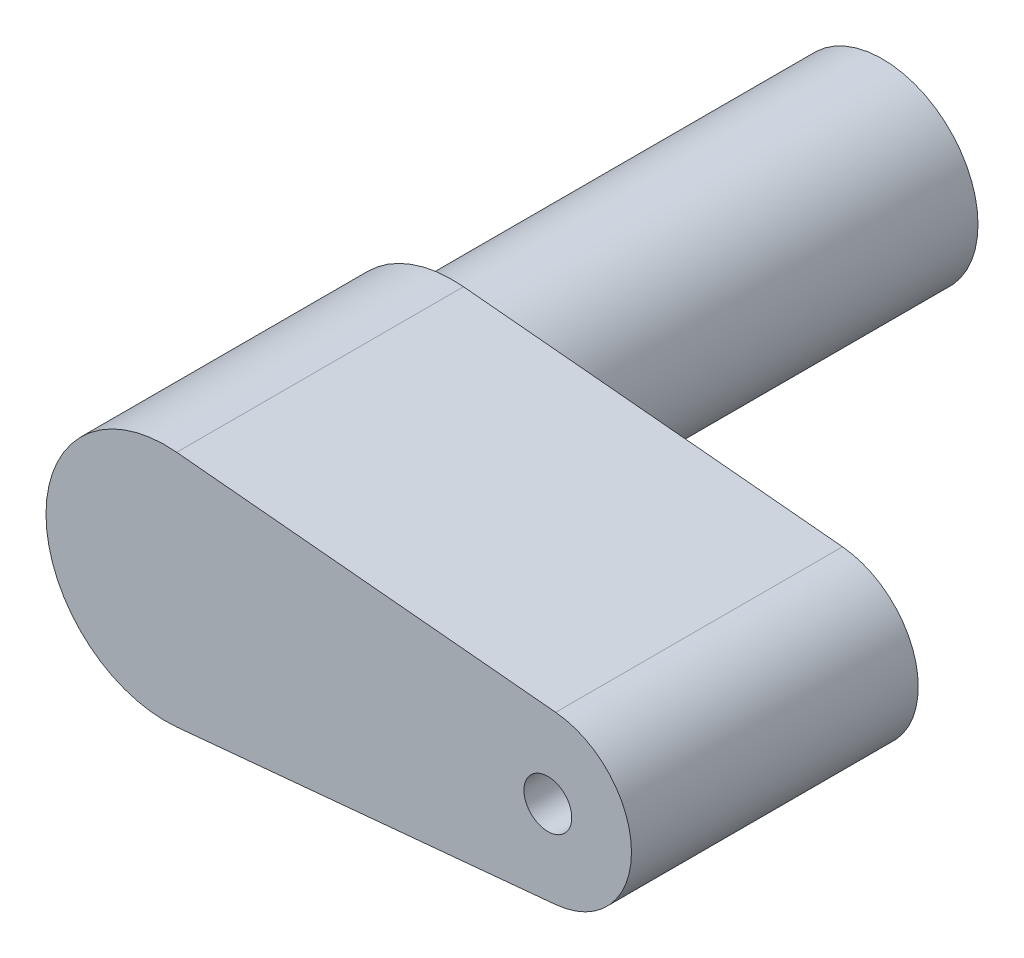
ISO-10303-21;
HEADER;
FILE_DESCRIPTION(('STEP AP214'),'2;1');
FILE_NAME('part.step','',(''),(''),'','','');
FILE_SCHEMA(('AUTOMOTIVE_DESIGN { 1 0 10303 214 1 1 1 1 }'));
ENDSEC;
DATA;
#1=APPLICATION_CONTEXT('core data for automotive mechanical design processes');
#2=APPLICATION_PROTOCOL_DEFINITION('international standard','automotive_design',2000,#1);
#3=PRODUCT_CONTEXT('',#1,'mechanical');
#4=PRODUCT('Part','Part','',(#3));
#5=PRODUCT_RELATED_PRODUCT_CATEGORY('part','',(#4));
#6=PRODUCT_DEFINITION_FORMATION('','',#4);
#7=PRODUCT_DEFINITION_CONTEXT('part definition',#1,'design');
#8=PRODUCT_DEFINITION('design','',#6,#7);
#9=PRODUCT_DEFINITION_SHAPE('','',#8);
#10=(LENGTH_UNIT() NAMED_UNIT(*) SI_UNIT(.MILLI.,.METRE.));
#11=(NAMED_UNIT(*) PLANE_ANGLE_UNIT() SI_UNIT($,.RADIAN.));
#12=(NAMED_UNIT(*) SI_UNIT($,.STERADIAN.) SOLID_ANGLE_UNIT());
#13=UNCERTAINTY_MEASURE_WITH_UNIT(LENGTH_MEASURE(1.E-05),#10,'distance_accuracy_value','');
#14=(GEOMETRIC_REPRESENTATION_CONTEXT(3) GLOBAL_UNCERTAINTY_ASSIGNED_CONTEXT((#13)) GLOBAL_UNIT_ASSIGNED_CONTEXT((#10,
#11,#12)) REPRESENTATION_CONTEXT('',''));
#15=CARTESIAN_POINT('',(0.,0.,0.));
#16=DIRECTION('',(0.,0.,1.));
#17=DIRECTION('',(1.,0.,0.));
#18=AXIS2_PLACEMENT_3D('',#15,#16,#17);
#19=CARTESIAN_POINT('',(0.,491.000207075114,30.));
#20=DIRECTION('',(0.,0.,-1.));
#21=DIRECTION('',(-1.,0.,0.));
#22=AXIS2_PLACEMENT_3D('',#19,#20,#21);
#23=CYLINDRICAL_SURFACE('',#22,4.);
#24=CARTESIAN_POINT('',(0.,491.000207075114,0.));
#25=DIRECTION('',(0.,0.,1.));
#26=DIRECTION('',(1.,0.,0.));
#27=AXIS2_PLACEMENT_3D('',#24,#25,#26);
#28=CIRCLE('',#27,4.);
#29=CARTESIAN_POINT('',(3.99999999999999,491.000207075114,0.));
#30=VERTEX_POINT('',#29);
#31=EDGE_CURVE('E48',#30,#30,#28,.T.);
#32=ORIENTED_EDGE('',*,*,#31,.T.);
#33=EDGE_LOOP('',(#32));
#34=FACE_BOUND('',#33,.T.);
#35=CARTESIAN_POINT('',(0.,491.000207075114,18.));
#36=DIRECTION('',(0.,0.,1.));
#37=DIRECTION('',(1.,0.,0.));
#38=AXIS2_PLACEMENT_3D('',#35,#36,#37);
#39=CIRCLE('',#38,4.);
#40=CARTESIAN_POINT('',(3.99999999999999,491.000207075114,18.));
#41=VERTEX_POINT('',#40);
#42=EDGE_CURVE('E11',#41,#41,#39,.T.);
#43=ORIENTED_EDGE('',*,*,#42,.F.);
#44=EDGE_LOOP('',(#43));
#45=FACE_BOUND('',#44,.T.);
#46=ADVANCED_FACE('F39',(#34,#45),#23,.T.);
#47=CARTESIAN_POINT('',(0.,491.000207075114,30.));
#48=DIRECTION('',(0.,0.,-1.));
#49=DIRECTION('',(-1.,0.,0.));
#50=AXIS2_PLACEMENT_3D('',#47,#48,#49);
#51=CYLINDRICAL_SURFACE('',#50,1.25);
#52=CARTESIAN_POINT('',(0.,491.000207075114,0.));
#53=DIRECTION('',(0.,0.,1.));
#54=DIRECTION('',(1.,0.,0.));
#55=AXIS2_PLACEMENT_3D('',#52,#53,#54);
#56=CIRCLE('',#55,1.25);
#57=CARTESIAN_POINT('',(1.24999999999999,491.000207075114,0.));
#58=VERTEX_POINT('',#57);
#59=EDGE_CURVE('E121',#58,#58,#56,.T.);
#60=ORIENTED_EDGE('',*,*,#59,.F.);
#61=EDGE_LOOP('',(#60));
#62=FACE_BOUND('',#61,.T.);
#63=CARTESIAN_POINT('',(0.,491.000207075114,18.));
#64=DIRECTION('',(0.,0.,1.));
#65=DIRECTION('',(1.,0.,0.));
#66=AXIS2_PLACEMENT_3D('',#63,#64,#65);
#67=CIRCLE('',#66,1.25);
#68=CARTESIAN_POINT('',(1.24999999999999,491.000207075114,18.));
#69=VERTEX_POINT('',#68);
#70=EDGE_CURVE('E42',#69,#69,#67,.T.);
#71=ORIENTED_EDGE('',*,*,#70,.T.);
#72=EDGE_LOOP('',(#71));
#73=FACE_BOUND('',#72,.T.);
#74=ADVANCED_FACE('F132',(#62,#73),#51,.F.);
#75=CARTESIAN_POINT('',(0.,491.000207075114,0.));
#76=DIRECTION('',(0.,0.,1.));
#77=DIRECTION('',(1.,0.,0.));
#78=AXIS2_PLACEMENT_3D('',#75,#76,#77);
#79=PLANE('',#78);
#80=ORIENTED_EDGE('',*,*,#31,.F.);
#81=EDGE_LOOP('',(#80));
#82=FACE_BOUND('',#81,.T.);
#83=ORIENTED_EDGE('',*,*,#59,.T.);
#84=EDGE_LOOP('',(#83));
#85=FACE_BOUND('',#84,.T.);
#86=ADVANCED_FACE('F128',(#82,#85),#79,.F.);
#87=CARTESIAN_POINT('',(16.,491.000207075114,18.));
#88=DIRECTION('',(0.,0.,1.));
#89=DIRECTION('',(1.,0.,0.));
#90=AXIS2_PLACEMENT_3D('',#87,#88,#89);
#91=PLANE('',#90);
#92=ORIENTED_EDGE('',*,*,#70,.F.);
#93=EDGE_LOOP('',(#92));
#94=FACE_BOUND('',#93,.T.);
#95=ADVANCED_FACE('F131',(#94),#91,.F.);
#96=CARTESIAN_POINT('',(16.,491.000207075114,18.));
#97=DIRECTION('',(0.,0.,1.));
#98=DIRECTION('',(1.,0.,0.));
#99=AXIS2_PLACEMENT_3D('',#96,#97,#98);
#100=CYLINDRICAL_SURFACE('',#99,3.50000000000001);
#101=CARTESIAN_POINT('',(16.,491.000207075114,30.));
#102=DIRECTION('',(0.,0.,1.));
#103=DIRECTION('',(1.,0.,0.));
#104=AXIS2_PLACEMENT_3D('',#101,#102,#103);
#105=CIRCLE('',#104,3.50000000000001);
#106=CARTESIAN_POINT('',(16.328125,487.51562187966,30.));
#107=VERTEX_POINT('',#106);
#108=CARTESIAN_POINT('',(16.328125,494.484792270567,30.));
#109=VERTEX_POINT('',#108);
#110=EDGE_CURVE('E109',#107,#109,#105,.T.);
#111=ORIENTED_EDGE('',*,*,#110,.F.);
#112=DIRECTION('',(0.,0.,1.));
#113=VECTOR('',#112,1.);
#114=CARTESIAN_POINT('',(16.328125,487.51562187966,18.));
#115=LINE('',#114,#113);
#116=CARTESIAN_POINT('',(16.328125,487.51562187966,18.));
#117=VERTEX_POINT('',#116);
#118=EDGE_CURVE('E57',#117,#107,#115,.T.);
#119=ORIENTED_EDGE('',*,*,#118,.F.);
#120=CARTESIAN_POINT('',(16.,491.000207075114,18.));
#121=DIRECTION('',(0.,0.,1.));
#122=DIRECTION('',(1.,0.,0.));
#123=AXIS2_PLACEMENT_3D('',#120,#121,#122);
#124=CIRCLE('',#123,3.50000000000001);
#125=CARTESIAN_POINT('',(16.328125,494.484792270567,18.));
#126=VERTEX_POINT('',#125);
#127=EDGE_CURVE('E102',#117,#126,#124,.T.);
#128=ORIENTED_EDGE('',*,*,#127,.T.);
#129=DIRECTION('',(0.,0.,1.));
#130=VECTOR('',#129,1.);
#131=CARTESIAN_POINT('',(16.328125,494.484792270567,18.));
#132=LINE('',#131,#130);
#133=EDGE_CURVE('E85',#126,#109,#132,.T.);
#134=ORIENTED_EDGE('',*,*,#133,.T.);
#135=EDGE_LOOP('',(#111,#119,#128,#134));
#136=FACE_BOUND('',#135,.T.);
#137=ADVANCED_FACE('F142',(#136),#100,.T.);
#138=CARTESIAN_POINT('',(0.468749999999982,486.022228224466,18.));
#139=DIRECTION('',(0.0937499999999982,-0.995595770129625,0.));
#140=DIRECTION('',(0.995595770129625,0.0937499999999983,0.));
#141=AXIS2_PLACEMENT_3D('',#138,#139,#140);
#142=PLANE('',#141);
#143=DIRECTION('',(0.995595770129625,0.0937499999999983,0.));
#144=VECTOR('',#143,1.);
#145=CARTESIAN_POINT('',(0.468749999999982,486.022228224466,30.));
#146=LINE('',#145,#144);
#147=CARTESIAN_POINT('',(0.46874999999998,486.022228224466,30.));
#148=VERTEX_POINT('',#147);
#149=EDGE_CURVE('E104',#148,#107,#146,.T.);
#150=ORIENTED_EDGE('',*,*,#149,.F.);
#151=DIRECTION('',(0.,0.,1.));
#152=VECTOR('',#151,1.);
#153=CARTESIAN_POINT('',(0.46874999999998,486.022228224466,18.));
#154=LINE('',#153,#152);
#155=CARTESIAN_POINT('',(0.46874999999998,486.022228224466,18.));
#156=VERTEX_POINT('',#155);
#157=EDGE_CURVE('E74',#156,#148,#154,.T.);
#158=ORIENTED_EDGE('',*,*,#157,.F.);
#159=DIRECTION('',(0.995595770129625,0.0937499999999983,0.));
#160=VECTOR('',#159,1.);
#161=CARTESIAN_POINT('',(0.468749999999982,486.022228224466,18.));
#162=LINE('',#161,#160);
#163=EDGE_CURVE('E99',#156,#117,#162,.T.);
#164=ORIENTED_EDGE('',*,*,#163,.T.);
#165=ORIENTED_EDGE('',*,*,#118,.T.);
#166=EDGE_LOOP('',(#150,#158,#164,#165));
#167=FACE_BOUND('',#166,.T.);
#168=ADVANCED_FACE('F147',(#167),#142,.T.);
#169=CARTESIAN_POINT('',(0.,491.000207075114,18.));
#170=DIRECTION('',(0.,0.,1.));
#171=DIRECTION('',(1.,0.,0.));
#172=AXIS2_PLACEMENT_3D('',#169,#170,#171);
#173=CYLINDRICAL_SURFACE('',#172,4.99999999999998);
#174=CARTESIAN_POINT('',(0.,491.000207075114,30.));
#175=DIRECTION('',(0.,0.,1.));
#176=DIRECTION('',(1.,0.,0.));
#177=AXIS2_PLACEMENT_3D('',#174,#175,#176);
#178=CIRCLE('',#177,4.99999999999998);
#179=CARTESIAN_POINT('',(0.468749999999981,495.978185925762,30.));
#180=VERTEX_POINT('',#179);
#181=EDGE_CURVE('E93',#180,#148,#178,.T.);
#182=ORIENTED_EDGE('',*,*,#181,.F.);
#183=DIRECTION('',(0.,0.,1.));
#184=VECTOR('',#183,1.);
#185=CARTESIAN_POINT('',(0.468749999999981,495.978185925762,18.));
#186=LINE('',#185,#184);
#187=CARTESIAN_POINT('',(0.468749999999981,495.978185925762,18.));
#188=VERTEX_POINT('',#187);
#189=EDGE_CURVE('E88',#188,#180,#186,.T.);
#190=ORIENTED_EDGE('',*,*,#189,.F.);
#191=CARTESIAN_POINT('',(0.,491.000207075114,18.));
#192=DIRECTION('',(0.,0.,1.));
#193=DIRECTION('',(1.,0.,0.));
#194=AXIS2_PLACEMENT_3D('',#191,#192,#193);
#195=CIRCLE('',#194,4.99999999999998);
#196=EDGE_CURVE('E91',#188,#156,#195,.T.);
#197=ORIENTED_EDGE('',*,*,#196,.T.);
#198=ORIENTED_EDGE('',*,*,#157,.T.);
#199=EDGE_LOOP('',(#182,#190,#197,#198));
#200=FACE_BOUND('',#199,.T.);
#201=ADVANCED_FACE('F90',(#200),#173,.T.);
#202=CARTESIAN_POINT('',(0.468749999999981,495.978185925762,18.));
#203=DIRECTION('',(0.0937499999999982,0.995595770129625,0.));
#204=DIRECTION('',(-0.995595770129625,0.0937499999999982,0.));
#205=AXIS2_PLACEMENT_3D('',#202,#203,#204);
#206=PLANE('',#205);
#207=DIRECTION('',(-0.995595770129625,0.0937499999999982,0.));
#208=VECTOR('',#207,1.);
#209=CARTESIAN_POINT('',(0.468749999999981,495.978185925762,30.));
#210=LINE('',#209,#208);
#211=EDGE_CURVE('E112',#109,#180,#210,.T.);
#212=ORIENTED_EDGE('',*,*,#211,.F.);
#213=ORIENTED_EDGE('',*,*,#133,.F.);
#214=DIRECTION('',(-0.995595770129625,0.0937499999999982,0.));
#215=VECTOR('',#214,1.);
#216=CARTESIAN_POINT('',(0.468749999999981,495.978185925762,18.));
#217=LINE('',#216,#215);
#218=EDGE_CURVE('E98',#126,#188,#217,.T.);
#219=ORIENTED_EDGE('',*,*,#218,.T.);
#220=ORIENTED_EDGE('',*,*,#189,.T.);
#221=EDGE_LOOP('',(#212,#213,#219,#220));
#222=FACE_BOUND('',#221,.T.);
#223=ADVANCED_FACE('F101',(#222),#206,.T.);
#224=CARTESIAN_POINT('',(16.,491.000207075114,18.));
#225=DIRECTION('',(0.,0.,1.));
#226=DIRECTION('',(1.,0.,0.));
#227=AXIS2_PLACEMENT_3D('',#224,#225,#226);
#228=CIRCLE('',#227,1.);
#229=CARTESIAN_POINT('',(17.,491.000207075114,18.));
#230=VERTEX_POINT('',#229);
#231=EDGE_CURVE('E113',#230,#230,#228,.F.);
#232=ORIENTED_EDGE('',*,*,#231,.F.);
#233=EDGE_LOOP('',(#232));
#234=FACE_BOUND('',#233,.T.);
#235=ORIENTED_EDGE('',*,*,#42,.T.);
#236=EDGE_LOOP('',(#235));
#237=FACE_BOUND('',#236,.T.);
#238=ORIENTED_EDGE('',*,*,#127,.F.);
#239=ORIENTED_EDGE('',*,*,#163,.F.);
#240=ORIENTED_EDGE('',*,*,#196,.F.);
#241=ORIENTED_EDGE('',*,*,#218,.F.);
#242=EDGE_LOOP('',(#238,#239,#240,#241));
#243=FACE_BOUND('',#242,.T.);
#244=ADVANCED_FACE('F97',(#234,#237,#243),#91,.F.);
#245=CARTESIAN_POINT('',(0.,491.000207075114,30.));
#246=DIRECTION('',(0.,0.,1.));
#247=DIRECTION('',(1.,0.,0.));
#248=AXIS2_PLACEMENT_3D('',#245,#246,#247);
#249=PLANE('',#248);
#250=CARTESIAN_POINT('',(16.,491.000207075114,30.));
#251=DIRECTION('',(0.,0.,1.));
#252=DIRECTION('',(1.,0.,0.));
#253=AXIS2_PLACEMENT_3D('',#250,#251,#252);
#254=CIRCLE('',#253,1.);
#255=CARTESIAN_POINT('',(17.,491.000207075114,30.));
#256=VERTEX_POINT('',#255);
#257=EDGE_CURVE('E238',#256,#256,#254,.T.);
#258=ORIENTED_EDGE('',*,*,#257,.F.);
#259=EDGE_LOOP('',(#258));
#260=FACE_BOUND('',#259,.T.);
#261=ORIENTED_EDGE('',*,*,#110,.T.);
#262=ORIENTED_EDGE('',*,*,#211,.T.);
#263=ORIENTED_EDGE('',*,*,#181,.T.);
#264=ORIENTED_EDGE('',*,*,#149,.T.);
#265=EDGE_LOOP('',(#261,#262,#263,#264));
#266=FACE_BOUND('',#265,.T.);
#267=ADVANCED_FACE('F152',(#260,#266),#249,.T.);
#268=CARTESIAN_POINT('',(16.,491.000207075114,15.1715728752538));
#269=DIRECTION('',(0.,0.,1.));
#270=DIRECTION('',(1.,0.,0.));
#271=AXIS2_PLACEMENT_3D('',#268,#269,#270);
#272=CYLINDRICAL_SURFACE('',#271,1.);
#273=ORIENTED_EDGE('',*,*,#231,.T.);
#274=EDGE_LOOP('',(#273));
#275=FACE_BOUND('',#274,.T.);
#276=ORIENTED_EDGE('',*,*,#257,.T.);
#277=EDGE_LOOP('',(#276));
#278=FACE_BOUND('',#277,.T.);
#279=ADVANCED_FACE('F216',(#275,#278),#272,.F.);
#280=CLOSED_SHELL('',(#46,#74,#86,#95,#137,#168,#201,#223,#244,#267,#279));
#281=MANIFOLD_SOLID_BREP('B2',#280);
#282=ADVANCED_BREP_SHAPE_REPRESENTATION('',(#18,#281),#14);
#283=SHAPE_DEFINITION_REPRESENTATION(#9,#282);
ENDSEC;
END-ISO-10303-21;
